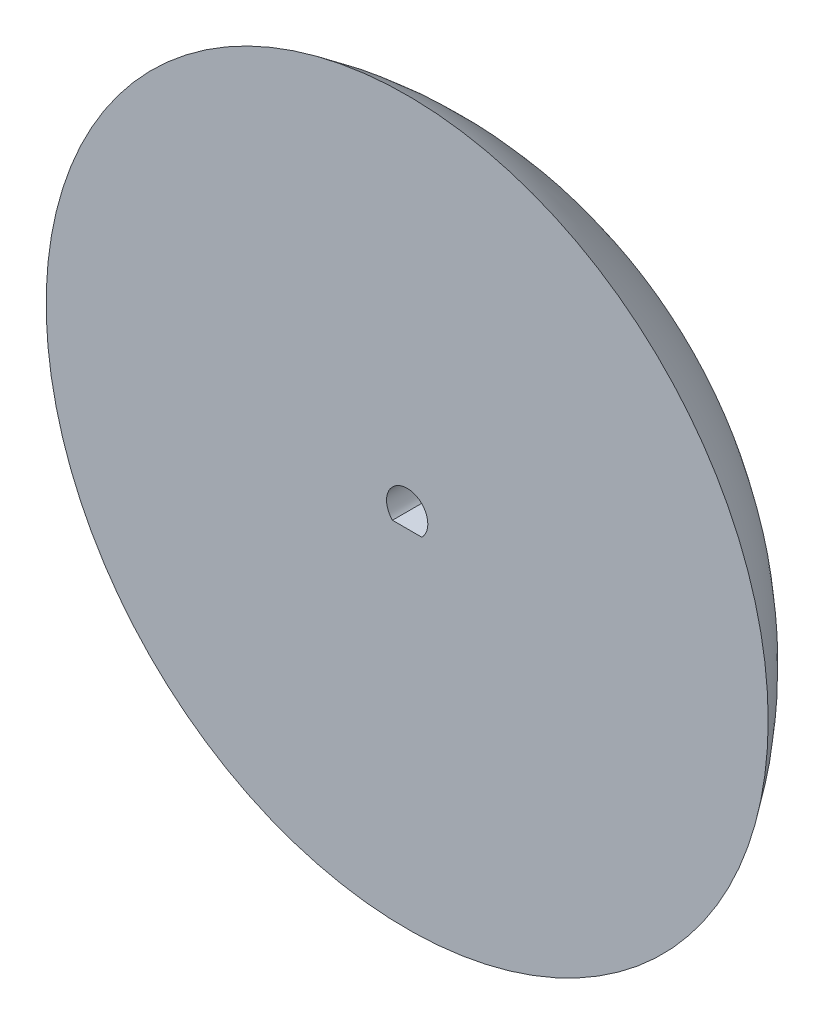
ISO-10303-21;
HEADER;
FILE_DESCRIPTION(('STEP AP214'),'2;1');
FILE_NAME('part.step','',(''),(''),'','','');
FILE_SCHEMA(('AUTOMOTIVE_DESIGN { 1 0 10303 214 1 1 1 1 }'));
ENDSEC;
DATA;
#1=APPLICATION_CONTEXT('core data for automotive mechanical design processes');
#2=APPLICATION_PROTOCOL_DEFINITION('international standard','automotive_design',2000,#1);
#3=PRODUCT_CONTEXT('',#1,'mechanical');
#4=PRODUCT('Part','Part','',(#3));
#5=PRODUCT_RELATED_PRODUCT_CATEGORY('part','',(#4));
#6=PRODUCT_DEFINITION_FORMATION('','',#4);
#7=PRODUCT_DEFINITION_CONTEXT('part definition',#1,'design');
#8=PRODUCT_DEFINITION('design','',#6,#7);
#9=PRODUCT_DEFINITION_SHAPE('','',#8);
#10=(LENGTH_UNIT() NAMED_UNIT(*) SI_UNIT(.MILLI.,.METRE.));
#11=(NAMED_UNIT(*) PLANE_ANGLE_UNIT() SI_UNIT($,.RADIAN.));
#12=(NAMED_UNIT(*) SI_UNIT($,.STERADIAN.) SOLID_ANGLE_UNIT());
#13=UNCERTAINTY_MEASURE_WITH_UNIT(LENGTH_MEASURE(1.E-05),#10,'distance_accuracy_value','');
#14=(GEOMETRIC_REPRESENTATION_CONTEXT(3) GLOBAL_UNCERTAINTY_ASSIGNED_CONTEXT((#13)) GLOBAL_UNIT_ASSIGNED_CONTEXT((#10,
#11,#12)) REPRESENTATION_CONTEXT('',''));
#15=CARTESIAN_POINT('',(0.,0.,0.));
#16=DIRECTION('',(0.,0.,1.));
#17=DIRECTION('',(1.,0.,0.));
#18=AXIS2_PLACEMENT_3D('',#15,#16,#17);
#19=CARTESIAN_POINT('',(0.,0.,18.6333333333334));
#20=DIRECTION('',(0.,0.,1.));
#21=DIRECTION('',(1.,0.,0.));
#22=AXIS2_PLACEMENT_3D('',#19,#20,#21);
#23=DEGENERATE_TOROIDAL_SURFACE('',#22,6.99999999999999,33.6333333333334,.T.);
#24=CARTESIAN_POINT('',(0.,0.,0.));
#25=DIRECTION('',(0.,0.,1.));
#26=DIRECTION('',(1.,0.,0.));
#27=AXIS2_PLACEMENT_3D('',#24,#25,#26);
#28=CIRCLE('',#27,35.);
#29=CARTESIAN_POINT('',(35.,0.,0.));
#30=VERTEX_POINT('',#29);
#31=EDGE_CURVE('E11',#30,#30,#28,.T.);
#32=ORIENTED_EDGE('',*,*,#31,.F.);
#33=EDGE_LOOP('',(#32));
#34=FACE_BOUND('',#33,.T.);
#35=CARTESIAN_POINT('',(0.,0.,-15.));
#36=DIRECTION('',(0.,0.,1.));
#37=DIRECTION('',(1.,0.,0.));
#38=AXIS2_PLACEMENT_3D('',#35,#36,#37);
#39=CIRCLE('',#38,7.);
#40=CARTESIAN_POINT('',(7.,0.,-15.));
#41=VERTEX_POINT('',#40);
#42=EDGE_CURVE('E46',#41,#41,#39,.T.);
#43=ORIENTED_EDGE('',*,*,#42,.T.);
#44=EDGE_LOOP('',(#43));
#45=FACE_BOUND('',#44,.T.);
#46=ADVANCED_FACE('F39',(#34,#45),#23,.T.);
#47=CARTESIAN_POINT('',(0.,35.,0.));
#48=DIRECTION('',(0.,0.,-1.));
#49=DIRECTION('',(-1.,0.,0.));
#50=AXIS2_PLACEMENT_3D('',#47,#48,#49);
#51=PLANE('',#50);
#52=DIRECTION('',(1.,0.,0.));
#53=VECTOR('',#52,1.);
#54=CARTESIAN_POINT('',(-1.42828568570857,-1.4,0.));
#55=LINE('',#54,#53);
#56=CARTESIAN_POINT('',(-1.42828568570857,-1.4,0.));
#57=VERTEX_POINT('',#56);
#58=CARTESIAN_POINT('',(1.42828568570857,-1.4,0.));
#59=VERTEX_POINT('',#58);
#60=EDGE_CURVE('E72',#57,#59,#55,.T.);
#61=ORIENTED_EDGE('',*,*,#60,.F.);
#62=CARTESIAN_POINT('',(0.,0.,0.));
#63=DIRECTION('',(0.,0.,1.));
#64=DIRECTION('',(-1.,0.,0.));
#65=AXIS2_PLACEMENT_3D('',#62,#63,#64);
#66=CIRCLE('',#65,2.);
#67=EDGE_CURVE('E53',#59,#57,#66,.T.);
#68=ORIENTED_EDGE('',*,*,#67,.F.);
#69=EDGE_LOOP('',(#61,#68));
#70=FACE_BOUND('',#69,.T.);
#71=ORIENTED_EDGE('',*,*,#31,.T.);
#72=EDGE_LOOP('',(#71));
#73=FACE_BOUND('',#72,.T.);
#74=ADVANCED_FACE('F76',(#70,#73),#51,.F.);
#75=CARTESIAN_POINT('',(0.,7.,-15.));
#76=DIRECTION('',(0.,0.,1.));
#77=DIRECTION('',(1.,0.,0.));
#78=AXIS2_PLACEMENT_3D('',#75,#76,#77);
#79=PLANE('',#78);
#80=ORIENTED_EDGE('',*,*,#42,.F.);
#81=EDGE_LOOP('',(#80));
#82=FACE_BOUND('',#81,.T.);
#83=ADVANCED_FACE('F87',(#82),#79,.F.);
#84=CARTESIAN_POINT('',(0.,0.,-10.1));
#85=DIRECTION('',(0.,0.,1.));
#86=DIRECTION('',(1.,0.,0.));
#87=AXIS2_PLACEMENT_3D('',#84,#85,#86);
#88=CYLINDRICAL_SURFACE('',#87,2.);
#89=ORIENTED_EDGE('',*,*,#67,.T.);
#90=DIRECTION('',(0.,0.,1.));
#91=VECTOR('',#90,1.);
#92=CARTESIAN_POINT('',(-1.42828568570857,-1.4,-10.1));
#93=LINE('',#92,#91);
#94=CARTESIAN_POINT('',(-1.42828568570857,-1.4,-10.1));
#95=VERTEX_POINT('',#94);
#96=EDGE_CURVE('E69',#95,#57,#93,.T.);
#97=ORIENTED_EDGE('',*,*,#96,.F.);
#98=CARTESIAN_POINT('',(0.,0.,-10.1));
#99=DIRECTION('',(0.,0.,1.));
#100=DIRECTION('',(-1.,0.,0.));
#101=AXIS2_PLACEMENT_3D('',#98,#99,#100);
#102=CIRCLE('',#101,2.);
#103=CARTESIAN_POINT('',(1.42828568570857,-1.4,-10.1));
#104=VERTEX_POINT('',#103);
#105=EDGE_CURVE('E67',#104,#95,#102,.T.);
#106=ORIENTED_EDGE('',*,*,#105,.F.);
#107=DIRECTION('',(0.,0.,1.));
#108=VECTOR('',#107,1.);
#109=CARTESIAN_POINT('',(1.42828568570857,-1.4,-10.1));
#110=LINE('',#109,#108);
#111=EDGE_CURVE('E61',#104,#59,#110,.T.);
#112=ORIENTED_EDGE('',*,*,#111,.T.);
#113=EDGE_LOOP('',(#89,#97,#106,#112));
#114=FACE_BOUND('',#113,.T.);
#115=ADVANCED_FACE('F65',(#114),#88,.F.);
#116=CARTESIAN_POINT('',(-1.42828568570857,-1.4,-10.1));
#117=DIRECTION('',(0.,-1.,0.));
#118=DIRECTION('',(0.,0.,-1.));
#119=AXIS2_PLACEMENT_3D('',#116,#117,#118);
#120=PLANE('',#119);
#121=ORIENTED_EDGE('',*,*,#60,.T.);
#122=ORIENTED_EDGE('',*,*,#111,.F.);
#123=DIRECTION('',(1.,0.,0.));
#124=VECTOR('',#123,1.);
#125=CARTESIAN_POINT('',(-1.42828568570857,-1.4,-10.1));
#126=LINE('',#125,#124);
#127=EDGE_CURVE('E80',#95,#104,#126,.T.);
#128=ORIENTED_EDGE('',*,*,#127,.F.);
#129=ORIENTED_EDGE('',*,*,#96,.T.);
#130=EDGE_LOOP('',(#121,#122,#128,#129));
#131=FACE_BOUND('',#130,.T.);
#132=ADVANCED_FACE('F73',(#131),#120,.F.);
#133=CARTESIAN_POINT('',(0.,0.,-10.1));
#134=DIRECTION('',(0.,0.,-1.));
#135=DIRECTION('',(-1.,0.,0.));
#136=AXIS2_PLACEMENT_3D('',#133,#134,#135);
#137=PLANE('',#136);
#138=ORIENTED_EDGE('',*,*,#105,.T.);
#139=ORIENTED_EDGE('',*,*,#127,.T.);
#140=EDGE_LOOP('',(#138,#139));
#141=FACE_BOUND('',#140,.T.);
#142=ADVANCED_FACE('F123',(#141),#137,.F.);
#143=CLOSED_SHELL('',(#46,#74,#83,#115,#132,#142));
#144=MANIFOLD_SOLID_BREP('B2',#143);
#145=ADVANCED_BREP_SHAPE_REPRESENTATION('',(#18,#144),#14);
#146=SHAPE_DEFINITION_REPRESENTATION(#9,#145);
ENDSEC;
END-ISO-10303-21;
